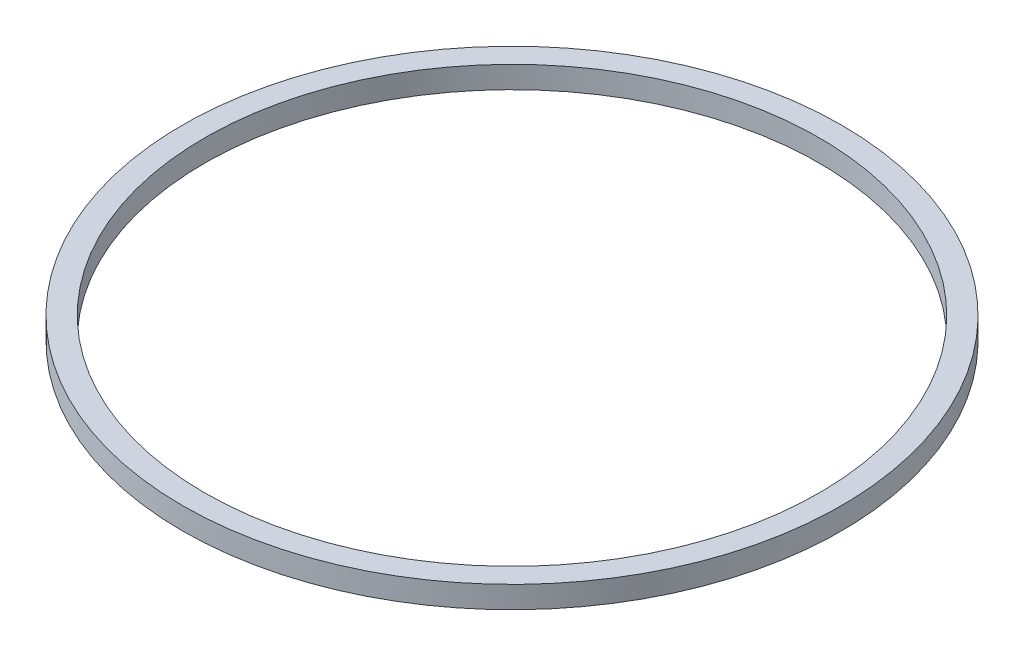
ISO-10303-21;
HEADER;
FILE_DESCRIPTION(('STEP AP214'),'2;1');
FILE_NAME('part.step','',(''),(''),'','','');
FILE_SCHEMA(('AUTOMOTIVE_DESIGN { 1 0 10303 214 1 1 1 1 }'));
ENDSEC;
DATA;
#1=APPLICATION_CONTEXT('core data for automotive mechanical design processes');
#2=APPLICATION_PROTOCOL_DEFINITION('international standard','automotive_design',2000,#1);
#3=PRODUCT_CONTEXT('',#1,'mechanical');
#4=PRODUCT('Part','Part','',(#3));
#5=PRODUCT_RELATED_PRODUCT_CATEGORY('part','',(#4));
#6=PRODUCT_DEFINITION_FORMATION('','',#4);
#7=PRODUCT_DEFINITION_CONTEXT('part definition',#1,'design');
#8=PRODUCT_DEFINITION('design','',#6,#7);
#9=PRODUCT_DEFINITION_SHAPE('','',#8);
#10=(LENGTH_UNIT() NAMED_UNIT(*) SI_UNIT(.MILLI.,.METRE.));
#11=(NAMED_UNIT(*) PLANE_ANGLE_UNIT() SI_UNIT($,.RADIAN.));
#12=(NAMED_UNIT(*) SI_UNIT($,.STERADIAN.) SOLID_ANGLE_UNIT());
#13=UNCERTAINTY_MEASURE_WITH_UNIT(LENGTH_MEASURE(1.E-05),#10,'distance_accuracy_value','');
#14=(GEOMETRIC_REPRESENTATION_CONTEXT(3) GLOBAL_UNCERTAINTY_ASSIGNED_CONTEXT((#13)) GLOBAL_UNIT_ASSIGNED_CONTEXT((#10,
#11,#12)) REPRESENTATION_CONTEXT('',''));
#15=CARTESIAN_POINT('',(0.,0.,0.));
#16=DIRECTION('',(0.,0.,1.));
#17=DIRECTION('',(1.,0.,0.));
#18=AXIS2_PLACEMENT_3D('',#15,#16,#17);
#19=CARTESIAN_POINT('',(0.,12.7,0.));
#20=DIRECTION('',(0.,1.,0.));
#21=DIRECTION('',(0.,0.,1.));
#22=AXIS2_PLACEMENT_3D('',#19,#20,#21);
#23=PLANE('',#22);
#24=CARTESIAN_POINT('',(0.,12.7,0.));
#25=DIRECTION('',(0.,1.,0.));
#26=DIRECTION('',(0.,0.,1.));
#27=AXIS2_PLACEMENT_3D('',#24,#25,#26);
#28=CIRCLE('',#27,190.6);
#29=CARTESIAN_POINT('',(0.,12.7,190.6));
#30=VERTEX_POINT('',#29);
#31=EDGE_CURVE('E10',#30,#30,#28,.T.);
#32=ORIENTED_EDGE('',*,*,#31,.T.);
#33=EDGE_LOOP('',(#32));
#34=FACE_BOUND('',#33,.T.);
#35=CARTESIAN_POINT('',(0.,12.7,0.));
#36=DIRECTION('',(0.,1.,0.));
#37=DIRECTION('',(0.,0.,1.));
#38=AXIS2_PLACEMENT_3D('',#35,#36,#37);
#39=CIRCLE('',#38,177.8);
#40=CARTESIAN_POINT('',(0.,12.7,177.8));
#41=VERTEX_POINT('',#40);
#42=EDGE_CURVE('E50',#41,#41,#39,.T.);
#43=ORIENTED_EDGE('',*,*,#42,.F.);
#44=EDGE_LOOP('',(#43));
#45=FACE_BOUND('',#44,.T.);
#46=ADVANCED_FACE('F37',(#34,#45),#23,.T.);
#47=CARTESIAN_POINT('',(0.,0.,0.));
#48=DIRECTION('',(0.,1.,0.));
#49=DIRECTION('',(0.,0.,1.));
#50=AXIS2_PLACEMENT_3D('',#47,#48,#49);
#51=PLANE('',#50);
#52=CARTESIAN_POINT('',(0.,0.,0.));
#53=DIRECTION('',(0.,1.,0.));
#54=DIRECTION('',(0.,0.,1.));
#55=AXIS2_PLACEMENT_3D('',#52,#53,#54);
#56=CIRCLE('',#55,190.6);
#57=CARTESIAN_POINT('',(0.,0.,190.6));
#58=VERTEX_POINT('',#57);
#59=EDGE_CURVE('E41',#58,#58,#56,.T.);
#60=ORIENTED_EDGE('',*,*,#59,.F.);
#61=EDGE_LOOP('',(#60));
#62=FACE_BOUND('',#61,.T.);
#63=CARTESIAN_POINT('',(0.,0.,0.));
#64=DIRECTION('',(0.,1.,0.));
#65=DIRECTION('',(0.,0.,1.));
#66=AXIS2_PLACEMENT_3D('',#63,#64,#65);
#67=CIRCLE('',#66,177.8);
#68=CARTESIAN_POINT('',(0.,0.,177.8));
#69=VERTEX_POINT('',#68);
#70=EDGE_CURVE('E52',#69,#69,#67,.T.);
#71=ORIENTED_EDGE('',*,*,#70,.T.);
#72=EDGE_LOOP('',(#71));
#73=FACE_BOUND('',#72,.T.);
#74=ADVANCED_FACE('F64',(#62,#73),#51,.F.);
#75=CARTESIAN_POINT('',(0.,12.7,0.));
#76=DIRECTION('',(0.,-1.,0.));
#77=DIRECTION('',(0.,0.,-1.));
#78=AXIS2_PLACEMENT_3D('',#75,#76,#77);
#79=CYLINDRICAL_SURFACE('',#78,190.6);
#80=ORIENTED_EDGE('',*,*,#31,.F.);
#81=EDGE_LOOP('',(#80));
#82=FACE_BOUND('',#81,.T.);
#83=ORIENTED_EDGE('',*,*,#59,.T.);
#84=EDGE_LOOP('',(#83));
#85=FACE_BOUND('',#84,.T.);
#86=ADVANCED_FACE('F39',(#82,#85),#79,.T.);
#87=CARTESIAN_POINT('',(0.,12.7,0.));
#88=DIRECTION('',(0.,-1.,0.));
#89=DIRECTION('',(0.,0.,-1.));
#90=AXIS2_PLACEMENT_3D('',#87,#88,#89);
#91=CYLINDRICAL_SURFACE('',#90,177.8);
#92=ORIENTED_EDGE('',*,*,#42,.T.);
#93=EDGE_LOOP('',(#92));
#94=FACE_BOUND('',#93,.T.);
#95=ORIENTED_EDGE('',*,*,#70,.F.);
#96=EDGE_LOOP('',(#95));
#97=FACE_BOUND('',#96,.T.);
#98=ADVANCED_FACE('F60',(#94,#97),#91,.F.);
#99=CLOSED_SHELL('',(#46,#74,#86,#98));
#100=MANIFOLD_SOLID_BREP('B2',#99);
#101=ADVANCED_BREP_SHAPE_REPRESENTATION('',(#18,#100),#14);
#102=SHAPE_DEFINITION_REPRESENTATION(#9,#101);
ENDSEC;
END-ISO-10303-21;
